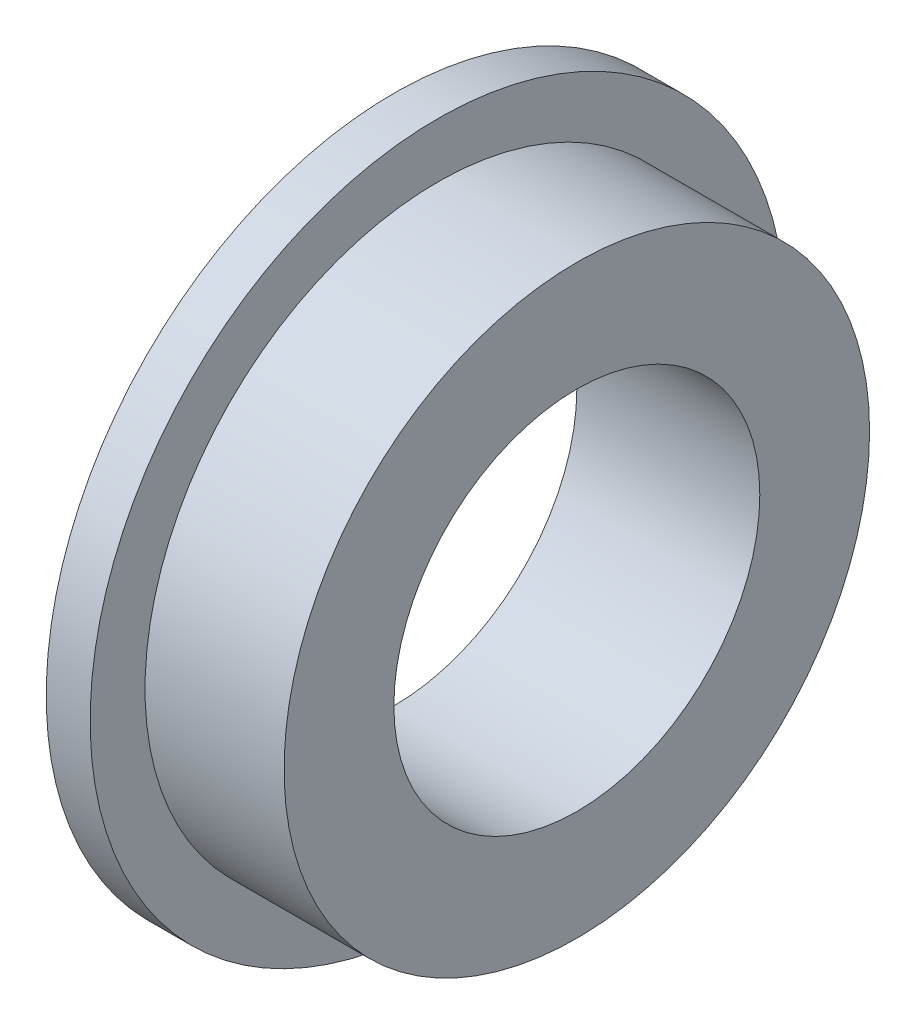
ISO-10303-21;
HEADER;
FILE_DESCRIPTION(('STEP AP214'),'2;1');
FILE_NAME('part.step','',(''),(''),'','','');
FILE_SCHEMA(('AUTOMOTIVE_DESIGN { 1 0 10303 214 1 1 1 1 }'));
ENDSEC;
DATA;
#1=APPLICATION_CONTEXT('core data for automotive mechanical design processes');
#2=APPLICATION_PROTOCOL_DEFINITION('international standard','automotive_design',2000,#1);
#3=PRODUCT_CONTEXT('',#1,'mechanical');
#4=PRODUCT('Part','Part','',(#3));
#5=PRODUCT_RELATED_PRODUCT_CATEGORY('part','',(#4));
#6=PRODUCT_DEFINITION_FORMATION('','',#4);
#7=PRODUCT_DEFINITION_CONTEXT('part definition',#1,'design');
#8=PRODUCT_DEFINITION('design','',#6,#7);
#9=PRODUCT_DEFINITION_SHAPE('','',#8);
#10=(LENGTH_UNIT() NAMED_UNIT(*) SI_UNIT(.MILLI.,.METRE.));
#11=(NAMED_UNIT(*) PLANE_ANGLE_UNIT() SI_UNIT($,.RADIAN.));
#12=(NAMED_UNIT(*) SI_UNIT($,.STERADIAN.) SOLID_ANGLE_UNIT());
#13=UNCERTAINTY_MEASURE_WITH_UNIT(LENGTH_MEASURE(1.E-05),#10,'distance_accuracy_value','');
#14=(GEOMETRIC_REPRESENTATION_CONTEXT(3) GLOBAL_UNCERTAINTY_ASSIGNED_CONTEXT((#13)) GLOBAL_UNIT_ASSIGNED_CONTEXT((#10,
#11,#12)) REPRESENTATION_CONTEXT('',''));
#15=CARTESIAN_POINT('',(0.,0.,0.));
#16=DIRECTION('',(0.,0.,1.));
#17=DIRECTION('',(1.,0.,0.));
#18=AXIS2_PLACEMENT_3D('',#15,#16,#17);
#19=CARTESIAN_POINT('',(2.5,0.,0.));
#20=DIRECTION('',(-1.,0.,0.));
#21=DIRECTION('',(0.,0.,1.));
#22=AXIS2_PLACEMENT_3D('',#19,#20,#21);
#23=CYLINDRICAL_SURFACE('',#22,2.5);
#24=CARTESIAN_POINT('',(2.5,0.,0.));
#25=DIRECTION('',(1.,0.,0.));
#26=DIRECTION('',(0.,0.,-1.));
#27=AXIS2_PLACEMENT_3D('',#24,#25,#26);
#28=CIRCLE('',#27,2.5);
#29=CARTESIAN_POINT('',(2.5,0.,-2.5));
#30=VERTEX_POINT('',#29);
#31=EDGE_CURVE('E51',#30,#30,#28,.T.);
#32=ORIENTED_EDGE('',*,*,#31,.T.);
#33=EDGE_LOOP('',(#32));
#34=FACE_BOUND('',#33,.T.);
#35=CARTESIAN_POINT('',(0.,0.,0.));
#36=DIRECTION('',(1.,0.,0.));
#37=DIRECTION('',(0.,0.,-1.));
#38=AXIS2_PLACEMENT_3D('',#35,#36,#37);
#39=CIRCLE('',#38,2.5);
#40=CARTESIAN_POINT('',(0.,0.,-2.5));
#41=VERTEX_POINT('',#40);
#42=EDGE_CURVE('E46',#41,#41,#39,.T.);
#43=ORIENTED_EDGE('',*,*,#42,.F.);
#44=EDGE_LOOP('',(#43));
#45=FACE_BOUND('',#44,.T.);
#46=ADVANCED_FACE('F43',(#34,#45),#23,.F.);
#47=CARTESIAN_POINT('',(2.5,0.,0.));
#48=DIRECTION('',(-1.,0.,0.));
#49=DIRECTION('',(0.,0.,1.));
#50=AXIS2_PLACEMENT_3D('',#47,#48,#49);
#51=CYLINDRICAL_SURFACE('',#50,4.);
#52=CARTESIAN_POINT('',(0.6,0.,0.));
#53=DIRECTION('',(1.,0.,0.));
#54=DIRECTION('',(0.,0.,-1.));
#55=AXIS2_PLACEMENT_3D('',#52,#53,#54);
#56=CIRCLE('',#55,4.);
#57=CARTESIAN_POINT('',(0.6,0.,-4.));
#58=VERTEX_POINT('',#57);
#59=EDGE_CURVE('E62',#58,#58,#56,.T.);
#60=ORIENTED_EDGE('',*,*,#59,.T.);
#61=EDGE_LOOP('',(#60));
#62=FACE_BOUND('',#61,.T.);
#63=CARTESIAN_POINT('',(2.5,0.,0.));
#64=DIRECTION('',(1.,0.,0.));
#65=DIRECTION('',(0.,0.,-1.));
#66=AXIS2_PLACEMENT_3D('',#63,#64,#65);
#67=CIRCLE('',#66,4.);
#68=CARTESIAN_POINT('',(2.5,0.,-4.));
#69=VERTEX_POINT('',#68);
#70=EDGE_CURVE('E10',#69,#69,#67,.T.);
#71=ORIENTED_EDGE('',*,*,#70,.F.);
#72=EDGE_LOOP('',(#71));
#73=FACE_BOUND('',#72,.T.);
#74=ADVANCED_FACE('F71',(#62,#73),#51,.T.);
#75=CARTESIAN_POINT('',(2.5,0.,0.));
#76=DIRECTION('',(1.,0.,0.));
#77=DIRECTION('',(0.,0.,-1.));
#78=AXIS2_PLACEMENT_3D('',#75,#76,#77);
#79=PLANE('',#78);
#80=ORIENTED_EDGE('',*,*,#31,.F.);
#81=EDGE_LOOP('',(#80));
#82=FACE_BOUND('',#81,.T.);
#83=ORIENTED_EDGE('',*,*,#70,.T.);
#84=EDGE_LOOP('',(#83));
#85=FACE_BOUND('',#84,.T.);
#86=ADVANCED_FACE('F88',(#82,#85),#79,.T.);
#87=CARTESIAN_POINT('',(0.,0.,0.));
#88=DIRECTION('',(1.,0.,0.));
#89=DIRECTION('',(0.,0.,-1.));
#90=AXIS2_PLACEMENT_3D('',#87,#88,#89);
#91=PLANE('',#90);
#92=ORIENTED_EDGE('',*,*,#42,.T.);
#93=EDGE_LOOP('',(#92));
#94=FACE_BOUND('',#93,.T.);
#95=CARTESIAN_POINT('',(0.,0.,0.));
#96=DIRECTION('',(1.,0.,0.));
#97=DIRECTION('',(0.,0.,-1.));
#98=AXIS2_PLACEMENT_3D('',#95,#96,#97);
#99=CIRCLE('',#98,4.75);
#100=CARTESIAN_POINT('',(0.,0.,-4.75));
#101=VERTEX_POINT('',#100);
#102=EDGE_CURVE('E58',#101,#101,#99,.T.);
#103=ORIENTED_EDGE('',*,*,#102,.F.);
#104=EDGE_LOOP('',(#103));
#105=FACE_BOUND('',#104,.T.);
#106=ADVANCED_FACE('F83',(#94,#105),#91,.F.);
#107=CARTESIAN_POINT('',(0.6,0.,0.));
#108=DIRECTION('',(-1.,0.,0.));
#109=DIRECTION('',(0.,0.,1.));
#110=AXIS2_PLACEMENT_3D('',#107,#108,#109);
#111=CYLINDRICAL_SURFACE('',#110,4.75);
#112=CARTESIAN_POINT('',(0.6,0.,0.));
#113=DIRECTION('',(1.,0.,0.));
#114=DIRECTION('',(0.,0.,-1.));
#115=AXIS2_PLACEMENT_3D('',#112,#113,#114);
#116=CIRCLE('',#115,4.75);
#117=CARTESIAN_POINT('',(0.6,0.,-4.75));
#118=VERTEX_POINT('',#117);
#119=EDGE_CURVE('E63',#118,#118,#116,.T.);
#120=ORIENTED_EDGE('',*,*,#119,.F.);
#121=EDGE_LOOP('',(#120));
#122=FACE_BOUND('',#121,.T.);
#123=ORIENTED_EDGE('',*,*,#102,.T.);
#124=EDGE_LOOP('',(#123));
#125=FACE_BOUND('',#124,.T.);
#126=ADVANCED_FACE('F77',(#122,#125),#111,.T.);
#127=CARTESIAN_POINT('',(0.6,0.,0.));
#128=DIRECTION('',(1.,0.,0.));
#129=DIRECTION('',(0.,0.,-1.));
#130=AXIS2_PLACEMENT_3D('',#127,#128,#129);
#131=PLANE('',#130);
#132=ORIENTED_EDGE('',*,*,#59,.F.);
#133=EDGE_LOOP('',(#132));
#134=FACE_BOUND('',#133,.T.);
#135=ORIENTED_EDGE('',*,*,#119,.T.);
#136=EDGE_LOOP('',(#135));
#137=FACE_BOUND('',#136,.T.);
#138=ADVANCED_FACE('F74',(#134,#137),#131,.T.);
#139=CLOSED_SHELL('',(#46,#74,#86,#106,#126,#138));
#140=MANIFOLD_SOLID_BREP('B2',#139);
#141=ADVANCED_BREP_SHAPE_REPRESENTATION('',(#18,#140),#14);
#142=SHAPE_DEFINITION_REPRESENTATION(#9,#141);
ENDSEC;
END-ISO-10303-21;
